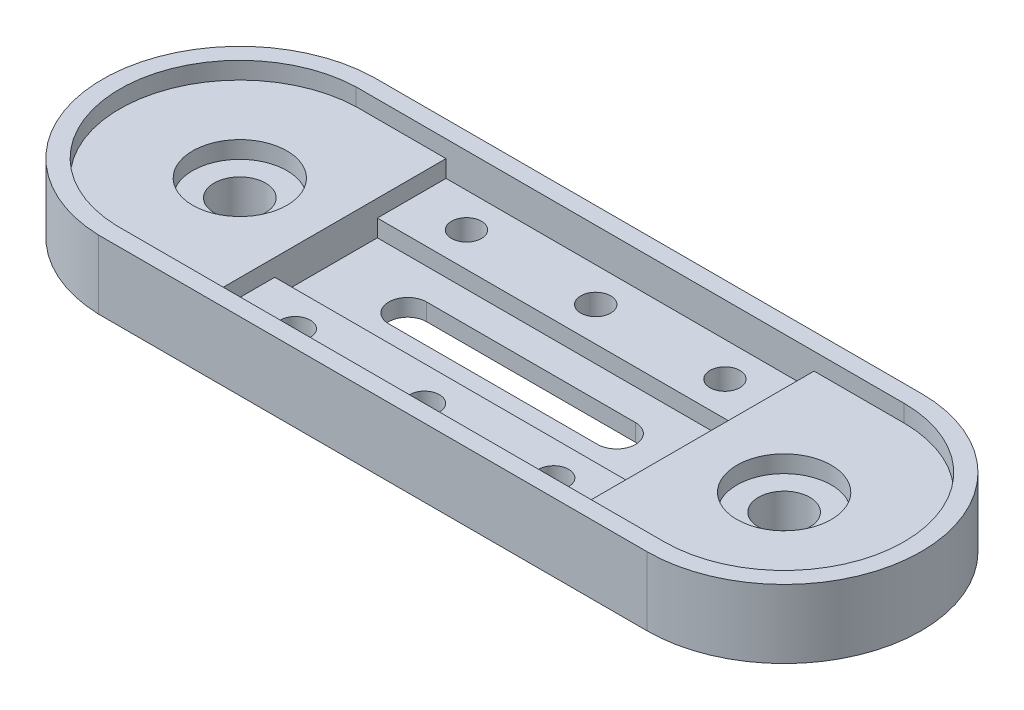
ISO-10303-21;
HEADER;
FILE_DESCRIPTION(('STEP AP214'),'2;1');
FILE_NAME('part.step','',(''),(''),'','','');
FILE_SCHEMA(('AUTOMOTIVE_DESIGN { 1 0 10303 214 1 1 1 1 }'));
ENDSEC;
DATA;
#1=APPLICATION_CONTEXT('core data for automotive mechanical design processes');
#2=APPLICATION_PROTOCOL_DEFINITION('international standard','automotive_design',2000,#1);
#3=PRODUCT_CONTEXT('',#1,'mechanical');
#4=PRODUCT('Part','Part','',(#3));
#5=PRODUCT_RELATED_PRODUCT_CATEGORY('part','',(#4));
#6=PRODUCT_DEFINITION_FORMATION('','',#4);
#7=PRODUCT_DEFINITION_CONTEXT('part definition',#1,'design');
#8=PRODUCT_DEFINITION('design','',#6,#7);
#9=PRODUCT_DEFINITION_SHAPE('','',#8);
#10=(LENGTH_UNIT() NAMED_UNIT(*) SI_UNIT(.MILLI.,.METRE.));
#11=(NAMED_UNIT(*) PLANE_ANGLE_UNIT() SI_UNIT($,.RADIAN.));
#12=(NAMED_UNIT(*) SI_UNIT($,.STERADIAN.) SOLID_ANGLE_UNIT());
#13=UNCERTAINTY_MEASURE_WITH_UNIT(LENGTH_MEASURE(1.E-05),#10,'distance_accuracy_value','');
#14=(GEOMETRIC_REPRESENTATION_CONTEXT(3) GLOBAL_UNCERTAINTY_ASSIGNED_CONTEXT((#13)) GLOBAL_UNIT_ASSIGNED_CONTEXT((#10,
#11,#12)) REPRESENTATION_CONTEXT('',''));
#15=CARTESIAN_POINT('',(0.,0.,0.));
#16=DIRECTION('',(0.,0.,1.));
#17=DIRECTION('',(1.,0.,0.));
#18=AXIS2_PLACEMENT_3D('',#15,#16,#17);
#19=CARTESIAN_POINT('',(84.9196432130697,-6.35,-3.175));
#20=DIRECTION('',(0.,1.,0.));
#21=DIRECTION('',(0.,0.,1.));
#22=AXIS2_PLACEMENT_3D('',#19,#20,#21);
#23=PLANE('',#22);
#24=CARTESIAN_POINT('',(26.8824600233302,-6.35,-41.263883343977));
#25=DIRECTION('',(0.,1.,0.));
#26=DIRECTION('',(0.,0.,1.));
#27=AXIS2_PLACEMENT_3D('',#24,#25,#26);
#28=CIRCLE('',#27,2.77812499999999);
#29=CARTESIAN_POINT('',(26.8824600233302,-6.35,-38.485758343977));
#30=VERTEX_POINT('',#29);
#31=EDGE_CURVE('E258',#30,#30,#28,.T.);
#32=ORIENTED_EDGE('',*,*,#31,.F.);
#33=EDGE_LOOP('',(#32));
#34=FACE_BOUND('',#33,.T.);
#35=CARTESIAN_POINT('',(50.8240758465719,-6.35,-41.263883343977));
#36=DIRECTION('',(0.,1.,0.));
#37=DIRECTION('',(0.,0.,1.));
#38=AXIS2_PLACEMENT_3D('',#35,#36,#37);
#39=CIRCLE('',#38,2.77812499999999);
#40=CARTESIAN_POINT('',(50.8240758465719,-6.35,-38.485758343977));
#41=VERTEX_POINT('',#40);
#42=EDGE_CURVE('E248',#41,#41,#39,.T.);
#43=ORIENTED_EDGE('',*,*,#42,.F.);
#44=EDGE_LOOP('',(#43));
#45=FACE_BOUND('',#44,.T.);
#46=CARTESIAN_POINT('',(74.7656916698137,-6.35,-41.263883343977));
#47=DIRECTION('',(0.,1.,0.));
#48=DIRECTION('',(0.,0.,1.));
#49=AXIS2_PLACEMENT_3D('',#46,#47,#48);
#50=CIRCLE('',#49,2.77812499999999);
#51=CARTESIAN_POINT('',(74.7656916698137,-6.35,-38.485758343977));
#52=VERTEX_POINT('',#51);
#53=EDGE_CURVE('E245',#52,#52,#50,.T.);
#54=ORIENTED_EDGE('',*,*,#53,.F.);
#55=EDGE_LOOP('',(#54));
#56=FACE_BOUND('',#55,.T.);
#57=DIRECTION('',(-1.,0.,0.));
#58=VECTOR('',#57,1.);
#59=CARTESIAN_POINT('',(16.7285084800742,-6.35,-34.902766687954));
#60=LINE('',#59,#58);
#61=CARTESIAN_POINT('',(84.9196432130697,-6.35,-34.902766687954));
#62=VERTEX_POINT('',#61);
#63=CARTESIAN_POINT('',(16.7285084800742,-6.35,-34.902766687954));
#64=VERTEX_POINT('',#63);
#65=EDGE_CURVE('E198',#62,#64,#60,.T.);
#66=ORIENTED_EDGE('',*,*,#65,.F.);
#67=DIRECTION('',(0.,0.,-1.));
#68=VECTOR('',#67,1.);
#69=CARTESIAN_POINT('',(84.9196432130697,-6.35,-47.625));
#70=LINE('',#69,#68);
#71=CARTESIAN_POINT('',(84.9196432130697,-6.35,-47.625));
#72=VERTEX_POINT('',#71);
#73=EDGE_CURVE('E415',#62,#72,#70,.T.);
#74=ORIENTED_EDGE('',*,*,#73,.T.);
#75=DIRECTION('',(-1.,0.,0.));
#76=VECTOR('',#75,1.);
#77=CARTESIAN_POINT('',(16.7285084800742,-6.35,-47.625));
#78=LINE('',#77,#76);
#79=CARTESIAN_POINT('',(16.7285084800742,-6.35,-47.625));
#80=VERTEX_POINT('',#79);
#81=EDGE_CURVE('E414',#72,#80,#78,.T.);
#82=ORIENTED_EDGE('',*,*,#81,.T.);
#83=DIRECTION('',(0.,0.,1.));
#84=VECTOR('',#83,1.);
#85=CARTESIAN_POINT('',(16.7285084800742,-6.35,-47.625));
#86=LINE('',#85,#84);
#87=EDGE_CURVE('E426',#80,#64,#86,.T.);
#88=ORIENTED_EDGE('',*,*,#87,.T.);
#89=EDGE_LOOP('',(#66,#74,#82,#88));
#90=FACE_BOUND('',#89,.T.);
#91=ADVANCED_FACE('F31',(#34,#45,#56,#90),#23,.T.);
#92=CARTESIAN_POINT('',(101.6,-3.175,-25.4));
#93=DIRECTION('',(0.,1.,0.));
#94=DIRECTION('',(0.,0.,1.));
#95=AXIS2_PLACEMENT_3D('',#92,#93,#94);
#96=PLANE('',#95);
#97=CARTESIAN_POINT('',(101.6,-3.175,-25.4));
#98=DIRECTION('',(0.,1.,0.));
#99=DIRECTION('',(0.,0.,1.));
#100=AXIS2_PLACEMENT_3D('',#97,#98,#99);
#101=CIRCLE('',#100,8.7376);
#102=CARTESIAN_POINT('',(101.6,-3.175,-16.6624));
#103=VERTEX_POINT('',#102);
#104=EDGE_CURVE('E275',#103,#103,#101,.T.);
#105=ORIENTED_EDGE('',*,*,#104,.F.);
#106=EDGE_LOOP('',(#105));
#107=FACE_BOUND('',#106,.T.);
#108=DIRECTION('',(0.,0.,-1.));
#109=VECTOR('',#108,1.);
#110=CARTESIAN_POINT('',(84.9196432130697,-3.175,-47.625));
#111=LINE('',#110,#109);
#112=CARTESIAN_POINT('',(84.9196432130697,-3.175,-3.175));
#113=VERTEX_POINT('',#112);
#114=CARTESIAN_POINT('',(84.9196432130697,-3.175,-47.625));
#115=VERTEX_POINT('',#114);
#116=EDGE_CURVE('E306',#113,#115,#111,.T.);
#117=ORIENTED_EDGE('',*,*,#116,.F.);
#118=DIRECTION('',(1.,0.,0.));
#119=VECTOR('',#118,1.);
#120=CARTESIAN_POINT('',(0.0481516931438191,-3.175,-3.175));
#121=LINE('',#120,#119);
#122=CARTESIAN_POINT('',(101.6,-3.175,-3.175));
#123=VERTEX_POINT('',#122);
#124=EDGE_CURVE('E309',#113,#123,#121,.T.);
#125=ORIENTED_EDGE('',*,*,#124,.T.);
#126=CARTESIAN_POINT('',(101.6,-3.175,-25.4));
#127=DIRECTION('',(0.,1.,0.));
#128=DIRECTION('',(0.,0.,1.));
#129=AXIS2_PLACEMENT_3D('',#126,#127,#128);
#130=CIRCLE('',#129,22.225);
#131=CARTESIAN_POINT('',(101.6,-3.175,-47.625));
#132=VERTEX_POINT('',#131);
#133=EDGE_CURVE('E353',#123,#132,#130,.T.);
#134=ORIENTED_EDGE('',*,*,#133,.T.);
#135=DIRECTION('',(-1.,0.,0.));
#136=VECTOR('',#135,1.);
#137=CARTESIAN_POINT('',(101.6,-3.175,-47.625));
#138=LINE('',#137,#136);
#139=EDGE_CURVE('E312',#132,#115,#138,.T.);
#140=ORIENTED_EDGE('',*,*,#139,.T.);
#141=EDGE_LOOP('',(#117,#125,#134,#140));
#142=FACE_BOUND('',#141,.T.);
#143=ADVANCED_FACE('F298',(#107,#142),#96,.T.);
#144=CARTESIAN_POINT('',(0.745713986586086,-12.7,-25.4));
#145=DIRECTION('',(0.,1.,0.));
#146=DIRECTION('',(0.,0.,1.));
#147=AXIS2_PLACEMENT_3D('',#144,#145,#146);
#148=CYLINDRICAL_SURFACE('',#147,25.4109442829225);
#149=CARTESIAN_POINT('',(0.745713986586086,0.,-25.4));
#150=DIRECTION('',(0.,1.,0.));
#151=DIRECTION('',(0.,0.,1.));
#152=AXIS2_PLACEMENT_3D('',#149,#150,#151);
#153=CIRCLE('',#152,25.4109442829225);
#154=CARTESIAN_POINT('',(0.,0.,-50.8));
#155=VERTEX_POINT('',#154);
#156=CARTESIAN_POINT('',(0.,0.,0.));
#157=VERTEX_POINT('',#156);
#158=EDGE_CURVE('E355',#155,#157,#153,.T.);
#159=ORIENTED_EDGE('',*,*,#158,.F.);
#160=DIRECTION('',(0.,1.,0.));
#161=VECTOR('',#160,1.);
#162=CARTESIAN_POINT('',(0.,-12.7,-50.8));
#163=LINE('',#162,#161);
#164=CARTESIAN_POINT('',(0.,-12.7,-50.8));
#165=VERTEX_POINT('',#164);
#166=EDGE_CURVE('E235',#165,#155,#163,.T.);
#167=ORIENTED_EDGE('',*,*,#166,.F.);
#168=CARTESIAN_POINT('',(0.745713986586086,-12.7,-25.4));
#169=DIRECTION('',(0.,1.,0.));
#170=DIRECTION('',(0.,0.,1.));
#171=AXIS2_PLACEMENT_3D('',#168,#169,#170);
#172=CIRCLE('',#171,25.4109442829225);
#173=CARTESIAN_POINT('',(0.,-12.7,0.));
#174=VERTEX_POINT('',#173);
#175=EDGE_CURVE('E362',#165,#174,#172,.T.);
#176=ORIENTED_EDGE('',*,*,#175,.T.);
#177=DIRECTION('',(0.,1.,0.));
#178=VECTOR('',#177,1.);
#179=CARTESIAN_POINT('',(0.,-12.7,0.));
#180=LINE('',#179,#178);
#181=EDGE_CURVE('E375',#174,#157,#180,.T.);
#182=ORIENTED_EDGE('',*,*,#181,.T.);
#183=EDGE_LOOP('',(#159,#167,#176,#182));
#184=FACE_BOUND('',#183,.T.);
#185=ADVANCED_FACE('F33',(#184),#148,.T.);
#186=CARTESIAN_POINT('',(0.,-12.7,-50.8));
#187=DIRECTION('',(0.,0.,-1.));
#188=DIRECTION('',(-1.,0.,0.));
#189=AXIS2_PLACEMENT_3D('',#186,#187,#188);
#190=PLANE('',#189);
#191=DIRECTION('',(-1.,0.,0.));
#192=VECTOR('',#191,1.);
#193=CARTESIAN_POINT('',(0.,0.,-50.8));
#194=LINE('',#193,#192);
#195=CARTESIAN_POINT('',(101.6,0.,-50.8));
#196=VERTEX_POINT('',#195);
#197=EDGE_CURVE('E366',#196,#155,#194,.T.);
#198=ORIENTED_EDGE('',*,*,#197,.F.);
#199=DIRECTION('',(0.,1.,0.));
#200=VECTOR('',#199,1.);
#201=CARTESIAN_POINT('',(101.6,-12.7,-50.8));
#202=LINE('',#201,#200);
#203=CARTESIAN_POINT('',(101.6,-12.7,-50.8));
#204=VERTEX_POINT('',#203);
#205=EDGE_CURVE('E387',#204,#196,#202,.T.);
#206=ORIENTED_EDGE('',*,*,#205,.F.);
#207=DIRECTION('',(-1.,0.,0.));
#208=VECTOR('',#207,1.);
#209=CARTESIAN_POINT('',(0.,-12.7,-50.8));
#210=LINE('',#209,#208);
#211=EDGE_CURVE('E372',#204,#165,#210,.T.);
#212=ORIENTED_EDGE('',*,*,#211,.T.);
#213=ORIENTED_EDGE('',*,*,#166,.T.);
#214=EDGE_LOOP('',(#198,#206,#212,#213));
#215=FACE_BOUND('',#214,.T.);
#216=ADVANCED_FACE('F788',(#215),#190,.T.);
#217=CARTESIAN_POINT('',(101.6,-12.7,-25.4));
#218=DIRECTION('',(0.,1.,0.));
#219=DIRECTION('',(0.,0.,1.));
#220=AXIS2_PLACEMENT_3D('',#217,#218,#219);
#221=CYLINDRICAL_SURFACE('',#220,25.4);
#222=CARTESIAN_POINT('',(101.6,0.,-25.4));
#223=DIRECTION('',(0.,1.,0.));
#224=DIRECTION('',(0.,0.,1.));
#225=AXIS2_PLACEMENT_3D('',#222,#223,#224);
#226=CIRCLE('',#225,25.4);
#227=CARTESIAN_POINT('',(101.6,0.,0.));
#228=VERTEX_POINT('',#227);
#229=EDGE_CURVE('E381',#228,#196,#226,.T.);
#230=ORIENTED_EDGE('',*,*,#229,.F.);
#231=DIRECTION('',(0.,1.,0.));
#232=VECTOR('',#231,1.);
#233=CARTESIAN_POINT('',(101.6,-12.7,0.));
#234=LINE('',#233,#232);
#235=CARTESIAN_POINT('',(101.6,-12.7,0.));
#236=VERTEX_POINT('',#235);
#237=EDGE_CURVE('E389',#236,#228,#234,.T.);
#238=ORIENTED_EDGE('',*,*,#237,.F.);
#239=CARTESIAN_POINT('',(101.6,-12.7,-25.4));
#240=DIRECTION('',(0.,1.,0.));
#241=DIRECTION('',(0.,0.,1.));
#242=AXIS2_PLACEMENT_3D('',#239,#240,#241);
#243=CIRCLE('',#242,25.4);
#244=EDGE_CURVE('E369',#236,#204,#243,.T.);
#245=ORIENTED_EDGE('',*,*,#244,.T.);
#246=ORIENTED_EDGE('',*,*,#205,.T.);
#247=EDGE_LOOP('',(#230,#238,#245,#246));
#248=FACE_BOUND('',#247,.T.);
#249=ADVANCED_FACE('F779',(#248),#221,.T.);
#250=CARTESIAN_POINT('',(0.,-12.7,0.));
#251=DIRECTION('',(0.,0.,1.));
#252=DIRECTION('',(1.,0.,0.));
#253=AXIS2_PLACEMENT_3D('',#250,#251,#252);
#254=PLANE('',#253);
#255=DIRECTION('',(1.,0.,0.));
#256=VECTOR('',#255,1.);
#257=CARTESIAN_POINT('',(0.,0.,0.));
#258=LINE('',#257,#256);
#259=EDGE_CURVE('E378',#157,#228,#258,.T.);
#260=ORIENTED_EDGE('',*,*,#259,.F.);
#261=ORIENTED_EDGE('',*,*,#181,.F.);
#262=DIRECTION('',(1.,0.,0.));
#263=VECTOR('',#262,1.);
#264=CARTESIAN_POINT('',(0.,-12.7,0.));
#265=LINE('',#264,#263);
#266=EDGE_CURVE('E365',#174,#236,#265,.T.);
#267=ORIENTED_EDGE('',*,*,#266,.T.);
#268=ORIENTED_EDGE('',*,*,#237,.T.);
#269=EDGE_LOOP('',(#260,#261,#267,#268));
#270=FACE_BOUND('',#269,.T.);
#271=ADVANCED_FACE('F530',(#270),#254,.T.);
#272=CARTESIAN_POINT('',(0.745713986586086,-12.7,-25.4));
#273=DIRECTION('',(0.,1.,0.));
#274=DIRECTION('',(0.,0.,1.));
#275=AXIS2_PLACEMENT_3D('',#272,#273,#274);
#276=PLANE('',#275);
#277=CARTESIAN_POINT('',(50.8240758465719,-12.7,-9.53611665602298));
#278=DIRECTION('',(0.,1.,0.));
#279=DIRECTION('',(0.,0.,1.));
#280=AXIS2_PLACEMENT_3D('',#277,#278,#279);
#281=CIRCLE('',#280,2.77812499999999);
#282=CARTESIAN_POINT('',(50.8240758465719,-12.7,-6.75799165602299));
#283=VERTEX_POINT('',#282);
#284=EDGE_CURVE('E703',#283,#283,#281,.T.);
#285=ORIENTED_EDGE('',*,*,#284,.T.);
#286=EDGE_LOOP('',(#285));
#287=FACE_BOUND('',#286,.T.);
#288=CARTESIAN_POINT('',(74.7656916698137,-12.7,-9.53611665602298));
#289=DIRECTION('',(0.,1.,0.));
#290=DIRECTION('',(0.,0.,1.));
#291=AXIS2_PLACEMENT_3D('',#288,#289,#290);
#292=CIRCLE('',#291,2.77812499999999);
#293=CARTESIAN_POINT('',(74.7656916698137,-12.7,-6.75799165602298));
#294=VERTEX_POINT('',#293);
#295=EDGE_CURVE('E705',#294,#294,#292,.T.);
#296=ORIENTED_EDGE('',*,*,#295,.T.);
#297=EDGE_LOOP('',(#296));
#298=FACE_BOUND('',#297,.T.);
#299=CARTESIAN_POINT('',(26.8824600233302,-12.7,-41.263883343977));
#300=DIRECTION('',(0.,1.,0.));
#301=DIRECTION('',(0.,0.,1.));
#302=AXIS2_PLACEMENT_3D('',#299,#300,#301);
#303=CIRCLE('',#302,2.77812499999999);
#304=CARTESIAN_POINT('',(26.8824600233302,-12.7,-38.485758343977));
#305=VERTEX_POINT('',#304);
#306=EDGE_CURVE('E35',#305,#305,#303,.T.);
#307=ORIENTED_EDGE('',*,*,#306,.T.);
#308=EDGE_LOOP('',(#307));
#309=FACE_BOUND('',#308,.T.);
#310=CARTESIAN_POINT('',(50.8240758465719,-12.7,-41.263883343977));
#311=DIRECTION('',(0.,1.,0.));
#312=DIRECTION('',(0.,0.,1.));
#313=AXIS2_PLACEMENT_3D('',#310,#311,#312);
#314=CIRCLE('',#313,2.77812499999999);
#315=CARTESIAN_POINT('',(50.8240758465719,-12.7,-38.485758343977));
#316=VERTEX_POINT('',#315);
#317=EDGE_CURVE('E246',#316,#316,#314,.T.);
#318=ORIENTED_EDGE('',*,*,#317,.T.);
#319=EDGE_LOOP('',(#318));
#320=FACE_BOUND('',#319,.T.);
#321=CARTESIAN_POINT('',(74.7656916698137,-12.7,-41.263883343977));
#322=DIRECTION('',(0.,1.,0.));
#323=DIRECTION('',(0.,0.,1.));
#324=AXIS2_PLACEMENT_3D('',#321,#322,#323);
#325=CIRCLE('',#324,2.77812499999999);
#326=CARTESIAN_POINT('',(74.7656916698137,-12.7,-38.485758343977));
#327=VERTEX_POINT('',#326);
#328=EDGE_CURVE('E243',#327,#327,#325,.T.);
#329=ORIENTED_EDGE('',*,*,#328,.T.);
#330=EDGE_LOOP('',(#329));
#331=FACE_BOUND('',#330,.T.);
#332=CARTESIAN_POINT('',(26.8824600233302,-12.7,-9.53611665602298));
#333=DIRECTION('',(0.,1.,0.));
#334=DIRECTION('',(0.,0.,1.));
#335=AXIS2_PLACEMENT_3D('',#332,#333,#334);
#336=CIRCLE('',#335,2.77812499999999);
#337=CARTESIAN_POINT('',(26.8824600233302,-12.7,-6.75799165602299));
#338=VERTEX_POINT('',#337);
#339=EDGE_CURVE('E238',#338,#338,#336,.T.);
#340=ORIENTED_EDGE('',*,*,#339,.T.);
#341=EDGE_LOOP('',(#340));
#342=FACE_BOUND('',#341,.T.);
#343=CARTESIAN_POINT('',(0.745713986586086,-12.7,-25.4));
#344=DIRECTION('',(0.,1.,0.));
#345=DIRECTION('',(0.,0.,1.));
#346=AXIS2_PLACEMENT_3D('',#343,#344,#345);
#347=CIRCLE('',#346,4.7625);
#348=CARTESIAN_POINT('',(0.745713986586086,-12.7,-20.6375));
#349=VERTEX_POINT('',#348);
#350=EDGE_CURVE('E272',#349,#349,#347,.T.);
#351=ORIENTED_EDGE('',*,*,#350,.T.);
#352=EDGE_LOOP('',(#351));
#353=FACE_BOUND('',#352,.T.);
#354=CARTESIAN_POINT('',(101.6,-12.7,-25.4));
#355=DIRECTION('',(0.,1.,0.));
#356=DIRECTION('',(0.,0.,1.));
#357=AXIS2_PLACEMENT_3D('',#354,#355,#356);
#358=CIRCLE('',#357,4.7625);
#359=CARTESIAN_POINT('',(101.6,-12.7,-20.6375));
#360=VERTEX_POINT('',#359);
#361=EDGE_CURVE('E187',#360,#360,#358,.T.);
#362=ORIENTED_EDGE('',*,*,#361,.T.);
#363=EDGE_LOOP('',(#362));
#364=FACE_BOUND('',#363,.T.);
#365=DIRECTION('',(-1.,0.,0.));
#366=VECTOR('',#365,1.);
#367=CARTESIAN_POINT('',(70.2866533848692,-12.7,-29.1792304649618));
#368=LINE('',#367,#366);
#369=CARTESIAN_POINT('',(70.2866533848692,-12.7,-29.1792304649618));
#370=VERTEX_POINT('',#369);
#371=CARTESIAN_POINT('',(31.5855244237362,-12.7,-29.1792304649618));
#372=VERTEX_POINT('',#371);
#373=EDGE_CURVE('E177',#370,#372,#368,.T.);
#374=ORIENTED_EDGE('',*,*,#373,.T.);
#375=CARTESIAN_POINT('',(31.5855244237362,-12.7,-25.6681444809317));
#376=DIRECTION('',(0.,1.,0.));
#377=DIRECTION('',(0.,0.,1.));
#378=AXIS2_PLACEMENT_3D('',#375,#376,#377);
#379=CIRCLE('',#378,3.51108598403016);
#380=CARTESIAN_POINT('',(31.5855244237362,-12.7,-22.1570584969015));
#381=VERTEX_POINT('',#380);
#382=EDGE_CURVE('E172',#372,#381,#379,.T.);
#383=ORIENTED_EDGE('',*,*,#382,.T.);
#384=DIRECTION('',(1.,0.,0.));
#385=VECTOR('',#384,1.);
#386=CARTESIAN_POINT('',(70.2866533848692,-12.7,-22.1570584969015));
#387=LINE('',#386,#385);
#388=CARTESIAN_POINT('',(70.2866533848692,-12.7,-22.1570584969015));
#389=VERTEX_POINT('',#388);
#390=EDGE_CURVE('E180',#381,#389,#387,.T.);
#391=ORIENTED_EDGE('',*,*,#390,.T.);
#392=CARTESIAN_POINT('',(70.2866533848692,-12.7,-25.6681444809317));
#393=DIRECTION('',(0.,1.,0.));
#394=DIRECTION('',(0.,0.,1.));
#395=AXIS2_PLACEMENT_3D('',#392,#393,#394);
#396=CIRCLE('',#395,3.51108598403016);
#397=EDGE_CURVE('E48',#389,#370,#396,.T.);
#398=ORIENTED_EDGE('',*,*,#397,.T.);
#399=EDGE_LOOP('',(#374,#383,#391,#398));
#400=FACE_BOUND('',#399,.T.);
#401=ORIENTED_EDGE('',*,*,#175,.F.);
#402=ORIENTED_EDGE('',*,*,#211,.F.);
#403=ORIENTED_EDGE('',*,*,#244,.F.);
#404=ORIENTED_EDGE('',*,*,#266,.F.);
#405=EDGE_LOOP('',(#401,#402,#403,#404));
#406=FACE_BOUND('',#405,.T.);
#407=ADVANCED_FACE('F184',(#287,#298,#309,#320,#331,#342,#353,#364,#400,#406),#276,.F.);
#408=CARTESIAN_POINT('',(0.745713986586086,0.,-25.4));
#409=DIRECTION('',(0.,1.,0.));
#410=DIRECTION('',(0.,0.,1.));
#411=AXIS2_PLACEMENT_3D('',#408,#409,#410);
#412=PLANE('',#411);
#413=CARTESIAN_POINT('',(101.6,0.,-25.4));
#414=DIRECTION('',(0.,1.,0.));
#415=DIRECTION('',(0.,0.,1.));
#416=AXIS2_PLACEMENT_3D('',#413,#414,#415);
#417=CIRCLE('',#416,22.225);
#418=CARTESIAN_POINT('',(101.6,0.,-3.175));
#419=VERTEX_POINT('',#418);
#420=CARTESIAN_POINT('',(101.6,0.,-47.625));
#421=VERTEX_POINT('',#420);
#422=EDGE_CURVE('E342',#419,#421,#417,.T.);
#423=ORIENTED_EDGE('',*,*,#422,.F.);
#424=DIRECTION('',(1.,0.,0.));
#425=VECTOR('',#424,1.);
#426=CARTESIAN_POINT('',(0.0481516931438191,0.,-3.175));
#427=LINE('',#426,#425);
#428=CARTESIAN_POINT('',(0.0481516931438159,0.,-3.175));
#429=VERTEX_POINT('',#428);
#430=EDGE_CURVE('E351',#429,#419,#427,.T.);
#431=ORIENTED_EDGE('',*,*,#430,.F.);
#432=CARTESIAN_POINT('',(0.745713986586086,0.,-25.4));
#433=DIRECTION('',(0.,1.,0.));
#434=DIRECTION('',(0.,0.,1.));
#435=AXIS2_PLACEMENT_3D('',#432,#433,#434);
#436=CIRCLE('',#435,22.2359442829225);
#437=CARTESIAN_POINT('',(0.0481516931439297,0.,-47.625));
#438=VERTEX_POINT('',#437);
#439=EDGE_CURVE('E348',#438,#429,#436,.T.);
#440=ORIENTED_EDGE('',*,*,#439,.F.);
#441=DIRECTION('',(-1.,0.,0.));
#442=VECTOR('',#441,1.);
#443=CARTESIAN_POINT('',(101.6,0.,-47.625));
#444=LINE('',#443,#442);
#445=EDGE_CURVE('E345',#421,#438,#444,.T.);
#446=ORIENTED_EDGE('',*,*,#445,.F.);
#447=EDGE_LOOP('',(#423,#431,#440,#446));
#448=FACE_BOUND('',#447,.T.);
#449=ORIENTED_EDGE('',*,*,#158,.T.);
#450=ORIENTED_EDGE('',*,*,#259,.T.);
#451=ORIENTED_EDGE('',*,*,#229,.T.);
#452=ORIENTED_EDGE('',*,*,#197,.T.);
#453=EDGE_LOOP('',(#449,#450,#451,#452));
#454=FACE_BOUND('',#453,.T.);
#455=ADVANCED_FACE('F463',(#448,#454),#412,.T.);
#456=CARTESIAN_POINT('',(101.6,-3.175,-25.4));
#457=DIRECTION('',(0.,1.,0.));
#458=DIRECTION('',(0.,0.,1.));
#459=AXIS2_PLACEMENT_3D('',#456,#457,#458);
#460=CYLINDRICAL_SURFACE('',#459,22.225);
#461=ORIENTED_EDGE('',*,*,#422,.T.);
#462=DIRECTION('',(0.,1.,0.));
#463=VECTOR('',#462,1.);
#464=CARTESIAN_POINT('',(101.6,-3.175,-47.625));
#465=LINE('',#464,#463);
#466=EDGE_CURVE('E330',#132,#421,#465,.T.);
#467=ORIENTED_EDGE('',*,*,#466,.F.);
#468=ORIENTED_EDGE('',*,*,#133,.F.);
#469=DIRECTION('',(0.,1.,0.));
#470=VECTOR('',#469,1.);
#471=CARTESIAN_POINT('',(101.6,-3.175,-3.175));
#472=LINE('',#471,#470);
#473=EDGE_CURVE('E324',#123,#419,#472,.T.);
#474=ORIENTED_EDGE('',*,*,#473,.T.);
#475=EDGE_LOOP('',(#461,#467,#468,#474));
#476=FACE_BOUND('',#475,.T.);
#477=ADVANCED_FACE('F466',(#476),#460,.F.);
#478=CARTESIAN_POINT('',(0.0481516931438191,-3.175,-3.175));
#479=DIRECTION('',(0.,0.,1.));
#480=DIRECTION('',(1.,0.,0.));
#481=AXIS2_PLACEMENT_3D('',#478,#479,#480);
#482=PLANE('',#481);
#483=ORIENTED_EDGE('',*,*,#430,.T.);
#484=ORIENTED_EDGE('',*,*,#473,.F.);
#485=ORIENTED_EDGE('',*,*,#124,.F.);
#486=DIRECTION('',(0.,1.,0.));
#487=VECTOR('',#486,1.);
#488=CARTESIAN_POINT('',(84.9196432130697,-6.35,-3.175));
#489=LINE('',#488,#487);
#490=CARTESIAN_POINT('',(84.9196432130697,-6.35,-3.175));
#491=VERTEX_POINT('',#490);
#492=EDGE_CURVE('E322',#491,#113,#489,.T.);
#493=ORIENTED_EDGE('',*,*,#492,.F.);
#494=DIRECTION('',(1.,0.,0.));
#495=VECTOR('',#494,1.);
#496=CARTESIAN_POINT('',(16.7285084800742,-6.35,-3.175));
#497=LINE('',#496,#495);
#498=CARTESIAN_POINT('',(16.7285084800742,-6.35,-3.175));
#499=VERTEX_POINT('',#498);
#500=EDGE_CURVE('E400',#499,#491,#497,.T.);
#501=ORIENTED_EDGE('',*,*,#500,.F.);
#502=DIRECTION('',(0.,1.,0.));
#503=VECTOR('',#502,1.);
#504=CARTESIAN_POINT('',(16.7285084800742,-6.35,-3.175));
#505=LINE('',#504,#503);
#506=CARTESIAN_POINT('',(16.7285084800742,-3.175,-3.175));
#507=VERTEX_POINT('',#506);
#508=EDGE_CURVE('E440',#499,#507,#505,.T.);
#509=ORIENTED_EDGE('',*,*,#508,.T.);
#510=CARTESIAN_POINT('',(0.0481516931438159,-3.175,-3.175));
#511=VERTEX_POINT('',#510);
#512=EDGE_CURVE('E326',#511,#507,#121,.T.);
#513=ORIENTED_EDGE('',*,*,#512,.F.);
#514=DIRECTION('',(0.,1.,0.));
#515=VECTOR('',#514,1.);
#516=CARTESIAN_POINT('',(0.0481516931438159,-3.175,-3.175));
#517=LINE('',#516,#515);
#518=EDGE_CURVE('E356',#511,#429,#517,.T.);
#519=ORIENTED_EDGE('',*,*,#518,.T.);
#520=EDGE_LOOP('',(#483,#484,#485,#493,#501,#509,#513,#519));
#521=FACE_BOUND('',#520,.T.);
#522=ADVANCED_FACE('F320',(#521),#482,.F.);
#523=CARTESIAN_POINT('',(0.745713986586086,-3.175,-25.4));
#524=DIRECTION('',(0.,1.,0.));
#525=DIRECTION('',(0.,0.,1.));
#526=AXIS2_PLACEMENT_3D('',#523,#524,#525);
#527=CYLINDRICAL_SURFACE('',#526,22.2359442829225);
#528=ORIENTED_EDGE('',*,*,#439,.T.);
#529=ORIENTED_EDGE('',*,*,#518,.F.);
#530=CARTESIAN_POINT('',(0.745713986586086,-3.175,-25.4));
#531=DIRECTION('',(0.,1.,0.));
#532=DIRECTION('',(0.,0.,1.));
#533=AXIS2_PLACEMENT_3D('',#530,#531,#532);
#534=CIRCLE('',#533,22.2359442829225);
#535=CARTESIAN_POINT('',(0.0481516931439297,-3.175,-47.625));
#536=VERTEX_POINT('',#535);
#537=EDGE_CURVE('E327',#536,#511,#534,.T.);
#538=ORIENTED_EDGE('',*,*,#537,.F.);
#539=DIRECTION('',(0.,1.,0.));
#540=VECTOR('',#539,1.);
#541=CARTESIAN_POINT('',(0.0481516931439297,-3.175,-47.625));
#542=LINE('',#541,#540);
#543=EDGE_CURVE('E358',#536,#438,#542,.T.);
#544=ORIENTED_EDGE('',*,*,#543,.T.);
#545=EDGE_LOOP('',(#528,#529,#538,#544));
#546=FACE_BOUND('',#545,.T.);
#547=ADVANCED_FACE('F459',(#546),#527,.F.);
#548=CARTESIAN_POINT('',(101.6,-3.175,-47.625));
#549=DIRECTION('',(0.,0.,-1.));
#550=DIRECTION('',(-1.,0.,0.));
#551=AXIS2_PLACEMENT_3D('',#548,#549,#550);
#552=PLANE('',#551);
#553=ORIENTED_EDGE('',*,*,#445,.T.);
#554=ORIENTED_EDGE('',*,*,#543,.F.);
#555=CARTESIAN_POINT('',(16.7285084800742,-3.175,-47.625));
#556=VERTEX_POINT('',#555);
#557=EDGE_CURVE('E392',#556,#536,#138,.T.);
#558=ORIENTED_EDGE('',*,*,#557,.F.);
#559=DIRECTION('',(0.,1.,0.));
#560=VECTOR('',#559,1.);
#561=CARTESIAN_POINT('',(16.7285084800742,-6.35,-47.625));
#562=LINE('',#561,#560);
#563=EDGE_CURVE('E408',#80,#556,#562,.T.);
#564=ORIENTED_EDGE('',*,*,#563,.F.);
#565=ORIENTED_EDGE('',*,*,#81,.F.);
#566=DIRECTION('',(0.,1.,0.));
#567=VECTOR('',#566,1.);
#568=CARTESIAN_POINT('',(84.9196432130697,-6.35,-47.625));
#569=LINE('',#568,#567);
#570=EDGE_CURVE('E406',#72,#115,#569,.T.);
#571=ORIENTED_EDGE('',*,*,#570,.T.);
#572=ORIENTED_EDGE('',*,*,#139,.F.);
#573=ORIENTED_EDGE('',*,*,#466,.T.);
#574=EDGE_LOOP('',(#553,#554,#558,#564,#565,#571,#572,#573));
#575=FACE_BOUND('',#574,.T.);
#576=ADVANCED_FACE('F454',(#575),#552,.F.);
#577=CARTESIAN_POINT('',(0.745713986586086,-3.175,-25.4));
#578=DIRECTION('',(0.,1.,0.));
#579=DIRECTION('',(0.,0.,1.));
#580=AXIS2_PLACEMENT_3D('',#577,#578,#579);
#581=CIRCLE('',#580,8.7376);
#582=CARTESIAN_POINT('',(0.745713986586086,-3.175,-16.6624));
#583=VERTEX_POINT('',#582);
#584=EDGE_CURVE('E241',#583,#583,#581,.T.);
#585=ORIENTED_EDGE('',*,*,#584,.F.);
#586=EDGE_LOOP('',(#585));
#587=FACE_BOUND('',#586,.T.);
#588=DIRECTION('',(0.,0.,1.));
#589=VECTOR('',#588,1.);
#590=CARTESIAN_POINT('',(16.7285084800742,-3.175,-47.625));
#591=LINE('',#590,#589);
#592=EDGE_CURVE('E315',#556,#507,#591,.T.);
#593=ORIENTED_EDGE('',*,*,#592,.F.);
#594=ORIENTED_EDGE('',*,*,#557,.T.);
#595=ORIENTED_EDGE('',*,*,#537,.T.);
#596=ORIENTED_EDGE('',*,*,#512,.T.);
#597=EDGE_LOOP('',(#593,#594,#595,#596));
#598=FACE_BOUND('',#597,.T.);
#599=ADVANCED_FACE('F302',(#587,#598),#96,.T.);
#600=CARTESIAN_POINT('',(84.9196432130697,-6.35,-47.625));
#601=DIRECTION('',(1.,0.,0.));
#602=DIRECTION('',(0.,0.,-1.));
#603=AXIS2_PLACEMENT_3D('',#600,#601,#602);
#604=PLANE('',#603);
#605=ORIENTED_EDGE('',*,*,#116,.T.);
#606=ORIENTED_EDGE('',*,*,#570,.F.);
#607=ORIENTED_EDGE('',*,*,#73,.F.);
#608=DIRECTION('',(0.,1.,0.));
#609=VECTOR('',#608,1.);
#610=CARTESIAN_POINT('',(84.9196432130697,-9.525,-34.902766687954));
#611=LINE('',#610,#609);
#612=CARTESIAN_POINT('',(84.9196432130697,-9.525,-34.902766687954));
#613=VERTEX_POINT('',#612);
#614=EDGE_CURVE('E216',#613,#62,#611,.T.);
#615=ORIENTED_EDGE('',*,*,#614,.F.);
#616=DIRECTION('',(0.,0.,-1.));
#617=VECTOR('',#616,1.);
#618=CARTESIAN_POINT('',(84.9196432130697,-9.525,-34.902766687954));
#619=LINE('',#618,#617);
#620=CARTESIAN_POINT('',(84.9196432130697,-9.525,-15.897233312046));
#621=VERTEX_POINT('',#620);
#622=EDGE_CURVE('E203',#621,#613,#619,.T.);
#623=ORIENTED_EDGE('',*,*,#622,.F.);
#624=DIRECTION('',(0.,1.,0.));
#625=VECTOR('',#624,1.);
#626=CARTESIAN_POINT('',(84.9196432130697,-9.525,-15.897233312046));
#627=LINE('',#626,#625);
#628=CARTESIAN_POINT('',(84.9196432130697,-6.35,-15.897233312046));
#629=VERTEX_POINT('',#628);
#630=EDGE_CURVE('E316',#621,#629,#627,.T.);
#631=ORIENTED_EDGE('',*,*,#630,.T.);
#632=EDGE_CURVE('E411',#491,#629,#70,.T.);
#633=ORIENTED_EDGE('',*,*,#632,.F.);
#634=ORIENTED_EDGE('',*,*,#492,.T.);
#635=EDGE_LOOP('',(#605,#606,#607,#615,#623,#631,#633,#634));
#636=FACE_BOUND('',#635,.T.);
#637=ADVANCED_FACE('F468',(#636),#604,.F.);
#638=CARTESIAN_POINT('',(16.7285084800742,-6.35,-47.625));
#639=DIRECTION('',(-1.,0.,0.));
#640=DIRECTION('',(0.,0.,1.));
#641=AXIS2_PLACEMENT_3D('',#638,#639,#640);
#642=PLANE('',#641);
#643=ORIENTED_EDGE('',*,*,#592,.T.);
#644=ORIENTED_EDGE('',*,*,#508,.F.);
#645=CARTESIAN_POINT('',(16.7285084800742,-6.35,-15.897233312046));
#646=VERTEX_POINT('',#645);
#647=EDGE_CURVE('E421',#646,#499,#86,.T.);
#648=ORIENTED_EDGE('',*,*,#647,.F.);
#649=DIRECTION('',(0.,1.,0.));
#650=VECTOR('',#649,1.);
#651=CARTESIAN_POINT('',(16.7285084800742,-9.525,-15.897233312046));
#652=LINE('',#651,#650);
#653=CARTESIAN_POINT('',(16.7285084800742,-9.525,-15.897233312046));
#654=VERTEX_POINT('',#653);
#655=EDGE_CURVE('E229',#654,#646,#652,.T.);
#656=ORIENTED_EDGE('',*,*,#655,.F.);
#657=DIRECTION('',(0.,0.,1.));
#658=VECTOR('',#657,1.);
#659=CARTESIAN_POINT('',(16.7285084800742,-9.525,-34.902766687954));
#660=LINE('',#659,#658);
#661=CARTESIAN_POINT('',(16.7285084800742,-9.525,-34.902766687954));
#662=VERTEX_POINT('',#661);
#663=EDGE_CURVE('E210',#662,#654,#660,.T.);
#664=ORIENTED_EDGE('',*,*,#663,.F.);
#665=DIRECTION('',(0.,1.,0.));
#666=VECTOR('',#665,1.);
#667=CARTESIAN_POINT('',(16.7285084800742,-9.525,-34.902766687954));
#668=LINE('',#667,#666);
#669=EDGE_CURVE('E227',#662,#64,#668,.T.);
#670=ORIENTED_EDGE('',*,*,#669,.T.);
#671=ORIENTED_EDGE('',*,*,#87,.F.);
#672=ORIENTED_EDGE('',*,*,#563,.T.);
#673=EDGE_LOOP('',(#643,#644,#648,#656,#664,#670,#671,#672));
#674=FACE_BOUND('',#673,.T.);
#675=ADVANCED_FACE('F441',(#674),#642,.F.);
#676=CARTESIAN_POINT('',(50.8240758465719,-6.35,-9.53611665602298));
#677=DIRECTION('',(0.,1.,0.));
#678=DIRECTION('',(0.,0.,1.));
#679=AXIS2_PLACEMENT_3D('',#676,#677,#678);
#680=CIRCLE('',#679,2.77812499999999);
#681=CARTESIAN_POINT('',(50.8240758465719,-6.35,-6.75799165602298));
#682=VERTEX_POINT('',#681);
#683=EDGE_CURVE('E513',#682,#682,#680,.T.);
#684=ORIENTED_EDGE('',*,*,#683,.F.);
#685=EDGE_LOOP('',(#684));
#686=FACE_BOUND('',#685,.T.);
#687=CARTESIAN_POINT('',(74.7656916698137,-6.35,-9.53611665602298));
#688=DIRECTION('',(0.,1.,0.));
#689=DIRECTION('',(0.,0.,1.));
#690=AXIS2_PLACEMENT_3D('',#687,#688,#689);
#691=CIRCLE('',#690,2.77812499999999);
#692=CARTESIAN_POINT('',(74.7656916698137,-6.35,-6.75799165602298));
#693=VERTEX_POINT('',#692);
#694=EDGE_CURVE('E517',#693,#693,#691,.T.);
#695=ORIENTED_EDGE('',*,*,#694,.F.);
#696=EDGE_LOOP('',(#695));
#697=FACE_BOUND('',#696,.T.);
#698=CARTESIAN_POINT('',(26.8824600233302,-6.35,-9.53611665602298));
#699=DIRECTION('',(0.,1.,0.));
#700=DIRECTION('',(0.,0.,1.));
#701=AXIS2_PLACEMENT_3D('',#698,#699,#700);
#702=CIRCLE('',#701,2.77812499999999);
#703=CARTESIAN_POINT('',(26.8824600233302,-6.35,-6.75799165602299));
#704=VERTEX_POINT('',#703);
#705=EDGE_CURVE('E242',#704,#704,#702,.T.);
#706=ORIENTED_EDGE('',*,*,#705,.F.);
#707=EDGE_LOOP('',(#706));
#708=FACE_BOUND('',#707,.T.);
#709=DIRECTION('',(1.,0.,0.));
#710=VECTOR('',#709,1.);
#711=CARTESIAN_POINT('',(16.7285084800742,-6.35,-15.897233312046));
#712=LINE('',#711,#710);
#713=EDGE_CURVE('E207',#646,#629,#712,.T.);
#714=ORIENTED_EDGE('',*,*,#713,.F.);
#715=ORIENTED_EDGE('',*,*,#647,.T.);
#716=ORIENTED_EDGE('',*,*,#500,.T.);
#717=ORIENTED_EDGE('',*,*,#632,.T.);
#718=EDGE_LOOP('',(#714,#715,#716,#717));
#719=FACE_BOUND('',#718,.T.);
#720=ADVANCED_FACE('F436',(#686,#697,#708,#719),#23,.T.);
#721=CARTESIAN_POINT('',(16.7285084800742,-9.525,-15.897233312046));
#722=DIRECTION('',(0.,0.,1.));
#723=DIRECTION('',(1.,0.,0.));
#724=AXIS2_PLACEMENT_3D('',#721,#722,#723);
#725=PLANE('',#724);
#726=ORIENTED_EDGE('',*,*,#713,.T.);
#727=ORIENTED_EDGE('',*,*,#630,.F.);
#728=DIRECTION('',(1.,0.,0.));
#729=VECTOR('',#728,1.);
#730=CARTESIAN_POINT('',(16.7285084800742,-9.525,-15.897233312046));
#731=LINE('',#730,#729);
#732=EDGE_CURVE('E213',#654,#621,#731,.T.);
#733=ORIENTED_EDGE('',*,*,#732,.F.);
#734=ORIENTED_EDGE('',*,*,#655,.T.);
#735=EDGE_LOOP('',(#726,#727,#733,#734));
#736=FACE_BOUND('',#735,.T.);
#737=ADVANCED_FACE('F481',(#736),#725,.F.);
#738=CARTESIAN_POINT('',(16.7285084800742,-9.525,-34.902766687954));
#739=DIRECTION('',(0.,0.,-1.));
#740=DIRECTION('',(-1.,0.,0.));
#741=AXIS2_PLACEMENT_3D('',#738,#739,#740);
#742=PLANE('',#741);
#743=ORIENTED_EDGE('',*,*,#65,.T.);
#744=ORIENTED_EDGE('',*,*,#669,.F.);
#745=DIRECTION('',(-1.,0.,0.));
#746=VECTOR('',#745,1.);
#747=CARTESIAN_POINT('',(16.7285084800742,-9.525,-34.902766687954));
#748=LINE('',#747,#746);
#749=EDGE_CURVE('E206',#613,#662,#748,.T.);
#750=ORIENTED_EDGE('',*,*,#749,.F.);
#751=ORIENTED_EDGE('',*,*,#614,.T.);
#752=EDGE_LOOP('',(#743,#744,#750,#751));
#753=FACE_BOUND('',#752,.T.);
#754=ADVANCED_FACE('F472',(#753),#742,.F.);
#755=CARTESIAN_POINT('',(84.9196432130697,-9.525,-15.897233312046));
#756=DIRECTION('',(0.,1.,0.));
#757=DIRECTION('',(0.,0.,1.));
#758=AXIS2_PLACEMENT_3D('',#755,#756,#757);
#759=PLANE('',#758);
#760=CARTESIAN_POINT('',(31.5855244237362,-9.525,-25.6681444809317));
#761=DIRECTION('',(0.,1.,0.));
#762=DIRECTION('',(0.,0.,1.));
#763=AXIS2_PLACEMENT_3D('',#760,#761,#762);
#764=CIRCLE('',#763,3.51108598403016);
#765=CARTESIAN_POINT('',(31.5855244237362,-9.525,-29.1792304649618));
#766=VERTEX_POINT('',#765);
#767=CARTESIAN_POINT('',(31.5855244237362,-9.525,-22.1570584969015));
#768=VERTEX_POINT('',#767);
#769=EDGE_CURVE('E11',#766,#768,#764,.T.);
#770=ORIENTED_EDGE('',*,*,#769,.F.);
#771=DIRECTION('',(-1.,0.,0.));
#772=VECTOR('',#771,1.);
#773=CARTESIAN_POINT('',(84.9196432130697,-9.525,-29.1792304649618));
#774=LINE('',#773,#772);
#775=CARTESIAN_POINT('',(70.2866533848692,-9.525,-29.1792304649618));
#776=VERTEX_POINT('',#775);
#777=EDGE_CURVE('E40',#776,#766,#774,.T.);
#778=ORIENTED_EDGE('',*,*,#777,.F.);
#779=CARTESIAN_POINT('',(70.2866533848692,-9.525,-25.6681444809317));
#780=DIRECTION('',(0.,1.,0.));
#781=DIRECTION('',(0.,0.,1.));
#782=AXIS2_PLACEMENT_3D('',#779,#780,#781);
#783=CIRCLE('',#782,3.51108598403016);
#784=CARTESIAN_POINT('',(70.2866533848692,-9.525,-22.1570584969015));
#785=VERTEX_POINT('',#784);
#786=EDGE_CURVE('E234',#785,#776,#783,.T.);
#787=ORIENTED_EDGE('',*,*,#786,.F.);
#788=DIRECTION('',(1.,0.,0.));
#789=VECTOR('',#788,1.);
#790=CARTESIAN_POINT('',(84.9196432130697,-9.525,-22.1570584969015));
#791=LINE('',#790,#789);
#792=EDGE_CURVE('E232',#768,#785,#791,.T.);
#793=ORIENTED_EDGE('',*,*,#792,.F.);
#794=EDGE_LOOP('',(#770,#778,#787,#793));
#795=FACE_BOUND('',#794,.T.);
#796=ORIENTED_EDGE('',*,*,#622,.T.);
#797=ORIENTED_EDGE('',*,*,#749,.T.);
#798=ORIENTED_EDGE('',*,*,#663,.T.);
#799=ORIENTED_EDGE('',*,*,#732,.T.);
#800=EDGE_LOOP('',(#796,#797,#798,#799));
#801=FACE_BOUND('',#800,.T.);
#802=ADVANCED_FACE('F484',(#795,#801),#759,.T.);
#803=CARTESIAN_POINT('',(31.5855244237362,-12.7,-25.6681444809317));
#804=DIRECTION('',(0.,1.,0.));
#805=DIRECTION('',(0.,0.,1.));
#806=AXIS2_PLACEMENT_3D('',#803,#804,#805);
#807=CYLINDRICAL_SURFACE('',#806,3.51108598403016);
#808=ORIENTED_EDGE('',*,*,#769,.T.);
#809=DIRECTION('',(0.,1.,0.));
#810=VECTOR('',#809,1.);
#811=CARTESIAN_POINT('',(31.5855244237362,-12.7,-22.1570584969015));
#812=LINE('',#811,#810);
#813=EDGE_CURVE('E56',#381,#768,#812,.T.);
#814=ORIENTED_EDGE('',*,*,#813,.F.);
#815=ORIENTED_EDGE('',*,*,#382,.F.);
#816=DIRECTION('',(0.,1.,0.));
#817=VECTOR('',#816,1.);
#818=CARTESIAN_POINT('',(31.5855244237362,-12.7,-29.1792304649618));
#819=LINE('',#818,#817);
#820=EDGE_CURVE('E196',#372,#766,#819,.T.);
#821=ORIENTED_EDGE('',*,*,#820,.T.);
#822=EDGE_LOOP('',(#808,#814,#815,#821));
#823=FACE_BOUND('',#822,.T.);
#824=ADVANCED_FACE('F169',(#823),#807,.F.);
#825=CARTESIAN_POINT('',(70.2866533848692,-12.7,-29.1792304649618));
#826=DIRECTION('',(0.,0.,-1.));
#827=DIRECTION('',(-1.,0.,0.));
#828=AXIS2_PLACEMENT_3D('',#825,#826,#827);
#829=PLANE('',#828);
#830=ORIENTED_EDGE('',*,*,#777,.T.);
#831=ORIENTED_EDGE('',*,*,#820,.F.);
#832=ORIENTED_EDGE('',*,*,#373,.F.);
#833=DIRECTION('',(0.,1.,0.));
#834=VECTOR('',#833,1.);
#835=CARTESIAN_POINT('',(70.2866533848692,-12.7,-29.1792304649618));
#836=LINE('',#835,#834);
#837=EDGE_CURVE('E199',#370,#776,#836,.T.);
#838=ORIENTED_EDGE('',*,*,#837,.T.);
#839=EDGE_LOOP('',(#830,#831,#832,#838));
#840=FACE_BOUND('',#839,.T.);
#841=ADVANCED_FACE('F492',(#840),#829,.F.);
#842=CARTESIAN_POINT('',(70.2866533848692,-12.7,-25.6681444809317));
#843=DIRECTION('',(0.,1.,0.));
#844=DIRECTION('',(0.,0.,1.));
#845=AXIS2_PLACEMENT_3D('',#842,#843,#844);
#846=CYLINDRICAL_SURFACE('',#845,3.51108598403016);
#847=ORIENTED_EDGE('',*,*,#786,.T.);
#848=ORIENTED_EDGE('',*,*,#837,.F.);
#849=ORIENTED_EDGE('',*,*,#397,.F.);
#850=DIRECTION('',(0.,1.,0.));
#851=VECTOR('',#850,1.);
#852=CARTESIAN_POINT('',(70.2866533848692,-12.7,-22.1570584969015));
#853=LINE('',#852,#851);
#854=EDGE_CURVE('E176',#389,#785,#853,.T.);
#855=ORIENTED_EDGE('',*,*,#854,.T.);
#856=EDGE_LOOP('',(#847,#848,#849,#855));
#857=FACE_BOUND('',#856,.T.);
#858=ADVANCED_FACE('F542',(#857),#846,.F.);
#859=CARTESIAN_POINT('',(70.2866533848692,-12.7,-22.1570584969015));
#860=DIRECTION('',(0.,0.,1.));
#861=DIRECTION('',(1.,0.,0.));
#862=AXIS2_PLACEMENT_3D('',#859,#860,#861);
#863=PLANE('',#862);
#864=ORIENTED_EDGE('',*,*,#792,.T.);
#865=ORIENTED_EDGE('',*,*,#854,.F.);
#866=ORIENTED_EDGE('',*,*,#390,.F.);
#867=ORIENTED_EDGE('',*,*,#813,.T.);
#868=EDGE_LOOP('',(#864,#865,#866,#867));
#869=FACE_BOUND('',#868,.T.);
#870=ADVANCED_FACE('F181',(#869),#863,.F.);
#871=CARTESIAN_POINT('',(101.6,-3.175,-25.4));
#872=DIRECTION('',(0.,1.,0.));
#873=DIRECTION('',(0.,0.,1.));
#874=AXIS2_PLACEMENT_3D('',#871,#872,#873);
#875=CYLINDRICAL_SURFACE('',#874,4.76250000000001);
#876=ORIENTED_EDGE('',*,*,#361,.F.);
#877=EDGE_LOOP('',(#876));
#878=FACE_BOUND('',#877,.T.);
#879=CARTESIAN_POINT('',(101.6,-6.35,-25.4));
#880=DIRECTION('',(0.,1.,0.));
#881=DIRECTION('',(0.,0.,1.));
#882=AXIS2_PLACEMENT_3D('',#879,#880,#881);
#883=CIRCLE('',#882,4.76250000000002);
#884=CARTESIAN_POINT('',(101.6,-6.35,-20.6375));
#885=VERTEX_POINT('',#884);
#886=EDGE_CURVE('E190',#885,#885,#883,.T.);
#887=ORIENTED_EDGE('',*,*,#886,.T.);
#888=EDGE_LOOP('',(#887));
#889=FACE_BOUND('',#888,.T.);
#890=ADVANCED_FACE('F283',(#878,#889),#875,.F.);
#891=CARTESIAN_POINT('',(106.3625,-6.35,-25.4));
#892=DIRECTION('',(0.,-1.,0.));
#893=DIRECTION('',(0.,0.,-1.));
#894=AXIS2_PLACEMENT_3D('',#891,#892,#893);
#895=PLANE('',#894);
#896=ORIENTED_EDGE('',*,*,#886,.F.);
#897=EDGE_LOOP('',(#896));
#898=FACE_BOUND('',#897,.T.);
#899=CARTESIAN_POINT('',(101.6,-6.35,-25.4));
#900=DIRECTION('',(0.,1.,0.));
#901=DIRECTION('',(0.,0.,1.));
#902=AXIS2_PLACEMENT_3D('',#899,#900,#901);
#903=CIRCLE('',#902,8.73759999999998);
#904=CARTESIAN_POINT('',(101.6,-6.35,-16.6624));
#905=VERTEX_POINT('',#904);
#906=EDGE_CURVE('E278',#905,#905,#903,.T.);
#907=ORIENTED_EDGE('',*,*,#906,.T.);
#908=EDGE_LOOP('',(#907));
#909=FACE_BOUND('',#908,.T.);
#910=ADVANCED_FACE('F285',(#898,#909),#895,.F.);
#911=CARTESIAN_POINT('',(101.6,-3.175,-25.4));
#912=DIRECTION('',(0.,1.,0.));
#913=DIRECTION('',(0.,0.,1.));
#914=AXIS2_PLACEMENT_3D('',#911,#912,#913);
#915=CYLINDRICAL_SURFACE('',#914,8.73759999999999);
#916=ORIENTED_EDGE('',*,*,#906,.F.);
#917=EDGE_LOOP('',(#916));
#918=FACE_BOUND('',#917,.T.);
#919=ORIENTED_EDGE('',*,*,#104,.T.);
#920=EDGE_LOOP('',(#919));
#921=FACE_BOUND('',#920,.T.);
#922=ADVANCED_FACE('F288',(#918,#921),#915,.F.);
#923=CARTESIAN_POINT('',(0.745713986586086,-3.175,-25.4));
#924=DIRECTION('',(0.,1.,0.));
#925=DIRECTION('',(0.,0.,1.));
#926=AXIS2_PLACEMENT_3D('',#923,#924,#925);
#927=CYLINDRICAL_SURFACE('',#926,4.7625);
#928=ORIENTED_EDGE('',*,*,#350,.F.);
#929=EDGE_LOOP('',(#928));
#930=FACE_BOUND('',#929,.T.);
#931=CARTESIAN_POINT('',(0.745713986586086,-6.35,-25.4));
#932=DIRECTION('',(0.,1.,0.));
#933=DIRECTION('',(0.,0.,1.));
#934=AXIS2_PLACEMENT_3D('',#931,#932,#933);
#935=CIRCLE('',#934,4.76250000000001);
#936=CARTESIAN_POINT('',(0.745713986586086,-6.35,-20.6375));
#937=VERTEX_POINT('',#936);
#938=EDGE_CURVE('E269',#937,#937,#935,.T.);
#939=ORIENTED_EDGE('',*,*,#938,.T.);
#940=EDGE_LOOP('',(#939));
#941=FACE_BOUND('',#940,.T.);
#942=ADVANCED_FACE('F294',(#930,#941),#927,.F.);
#943=CARTESIAN_POINT('',(5.5082139865861,-6.35,-25.4));
#944=DIRECTION('',(0.,-1.,0.));
#945=DIRECTION('',(0.,0.,-1.));
#946=AXIS2_PLACEMENT_3D('',#943,#944,#945);
#947=PLANE('',#946);
#948=ORIENTED_EDGE('',*,*,#938,.F.);
#949=EDGE_LOOP('',(#948));
#950=FACE_BOUND('',#949,.T.);
#951=CARTESIAN_POINT('',(0.745713986586086,-6.35,-25.4));
#952=DIRECTION('',(0.,1.,0.));
#953=DIRECTION('',(0.,0.,1.));
#954=AXIS2_PLACEMENT_3D('',#951,#952,#953);
#955=CIRCLE('',#954,8.73759999999999);
#956=CARTESIAN_POINT('',(0.745713986586086,-6.35,-16.6624));
#957=VERTEX_POINT('',#956);
#958=EDGE_CURVE('E266',#957,#957,#955,.T.);
#959=ORIENTED_EDGE('',*,*,#958,.T.);
#960=EDGE_LOOP('',(#959));
#961=FACE_BOUND('',#960,.T.);
#962=ADVANCED_FACE('F603',(#950,#961),#947,.F.);
#963=CARTESIAN_POINT('',(0.745713986586086,-3.175,-25.4));
#964=DIRECTION('',(0.,1.,0.));
#965=DIRECTION('',(0.,0.,1.));
#966=AXIS2_PLACEMENT_3D('',#963,#964,#965);
#967=CYLINDRICAL_SURFACE('',#966,8.73759999999999);
#968=ORIENTED_EDGE('',*,*,#958,.F.);
#969=EDGE_LOOP('',(#968));
#970=FACE_BOUND('',#969,.T.);
#971=ORIENTED_EDGE('',*,*,#584,.T.);
#972=EDGE_LOOP('',(#971));
#973=FACE_BOUND('',#972,.T.);
#974=ADVANCED_FACE('F524',(#970,#973),#967,.F.);
#975=CARTESIAN_POINT('',(26.8824600233302,-6.35,-9.53611665602298));
#976=DIRECTION('',(0.,1.,0.));
#977=DIRECTION('',(0.,0.,1.));
#978=AXIS2_PLACEMENT_3D('',#975,#976,#977);
#979=CYLINDRICAL_SURFACE('',#978,2.77812499999999);
#980=ORIENTED_EDGE('',*,*,#705,.T.);
#981=EDGE_LOOP('',(#980));
#982=FACE_BOUND('',#981,.T.);
#983=ORIENTED_EDGE('',*,*,#339,.F.);
#984=EDGE_LOOP('',(#983));
#985=FACE_BOUND('',#984,.T.);
#986=ADVANCED_FACE('F520',(#982,#985),#979,.F.);
#987=CARTESIAN_POINT('',(74.7656916698137,-6.35,-41.263883343977));
#988=DIRECTION('',(0.,1.,0.));
#989=DIRECTION('',(0.,0.,1.));
#990=AXIS2_PLACEMENT_3D('',#987,#988,#989);
#991=CYLINDRICAL_SURFACE('',#990,2.77812499999999);
#992=ORIENTED_EDGE('',*,*,#53,.T.);
#993=EDGE_LOOP('',(#992));
#994=FACE_BOUND('',#993,.T.);
#995=ORIENTED_EDGE('',*,*,#328,.F.);
#996=EDGE_LOOP('',(#995));
#997=FACE_BOUND('',#996,.T.);
#998=ADVANCED_FACE('F523',(#994,#997),#991,.F.);
#999=CARTESIAN_POINT('',(50.8240758465719,-6.35,-41.263883343977));
#1000=DIRECTION('',(0.,1.,0.));
#1001=DIRECTION('',(0.,0.,1.));
#1002=AXIS2_PLACEMENT_3D('',#999,#1000,#1001);
#1003=CYLINDRICAL_SURFACE('',#1002,2.77812499999999);
#1004=ORIENTED_EDGE('',*,*,#42,.T.);
#1005=EDGE_LOOP('',(#1004));
#1006=FACE_BOUND('',#1005,.T.);
#1007=ORIENTED_EDGE('',*,*,#317,.F.);
#1008=EDGE_LOOP('',(#1007));
#1009=FACE_BOUND('',#1008,.T.);
#1010=ADVANCED_FACE('F657',(#1006,#1009),#1003,.F.);
#1011=CARTESIAN_POINT('',(26.8824600233302,-6.35,-41.263883343977));
#1012=DIRECTION('',(0.,1.,0.));
#1013=DIRECTION('',(0.,0.,1.));
#1014=AXIS2_PLACEMENT_3D('',#1011,#1012,#1013);
#1015=CYLINDRICAL_SURFACE('',#1014,2.77812499999999);
#1016=ORIENTED_EDGE('',*,*,#31,.T.);
#1017=EDGE_LOOP('',(#1016));
#1018=FACE_BOUND('',#1017,.T.);
#1019=ORIENTED_EDGE('',*,*,#306,.F.);
#1020=EDGE_LOOP('',(#1019));
#1021=FACE_BOUND('',#1020,.T.);
#1022=ADVANCED_FACE('F667',(#1018,#1021),#1015,.F.);
#1023=CARTESIAN_POINT('',(74.7656916698137,-6.35,-9.53611665602298));
#1024=DIRECTION('',(0.,1.,0.));
#1025=DIRECTION('',(0.,0.,1.));
#1026=AXIS2_PLACEMENT_3D('',#1023,#1024,#1025);
#1027=CYLINDRICAL_SURFACE('',#1026,2.77812499999999);
#1028=ORIENTED_EDGE('',*,*,#694,.T.);
#1029=EDGE_LOOP('',(#1028));
#1030=FACE_BOUND('',#1029,.T.);
#1031=ORIENTED_EDGE('',*,*,#295,.F.);
#1032=EDGE_LOOP('',(#1031));
#1033=FACE_BOUND('',#1032,.T.);
#1034=ADVANCED_FACE('F676',(#1030,#1033),#1027,.F.);
#1035=CARTESIAN_POINT('',(50.8240758465719,-6.35,-9.53611665602298));
#1036=DIRECTION('',(0.,1.,0.));
#1037=DIRECTION('',(0.,0.,1.));
#1038=AXIS2_PLACEMENT_3D('',#1035,#1036,#1037);
#1039=CYLINDRICAL_SURFACE('',#1038,2.77812499999999);
#1040=ORIENTED_EDGE('',*,*,#683,.T.);
#1041=EDGE_LOOP('',(#1040));
#1042=FACE_BOUND('',#1041,.T.);
#1043=ORIENTED_EDGE('',*,*,#284,.F.);
#1044=EDGE_LOOP('',(#1043));
#1045=FACE_BOUND('',#1044,.T.);
#1046=ADVANCED_FACE('F686',(#1042,#1045),#1039,.F.);
#1047=CLOSED_SHELL('',(#91,#143,#185,#216,#249,#271,#407,#455,#477,#522,#547,#576,#599,#637,
#675,#720,#737,#754,#802,#824,#841,#858,#870,#890,#910,#922,#942,#962,#974,#986,#998,#1010,
#1022,#1034,#1046));
#1048=MANIFOLD_SOLID_BREP('B2',#1047);
#1049=ADVANCED_BREP_SHAPE_REPRESENTATION('',(#18,#1048),#14);
#1050=SHAPE_DEFINITION_REPRESENTATION(#9,#1049);
ENDSEC;
END-ISO-10303-21;
